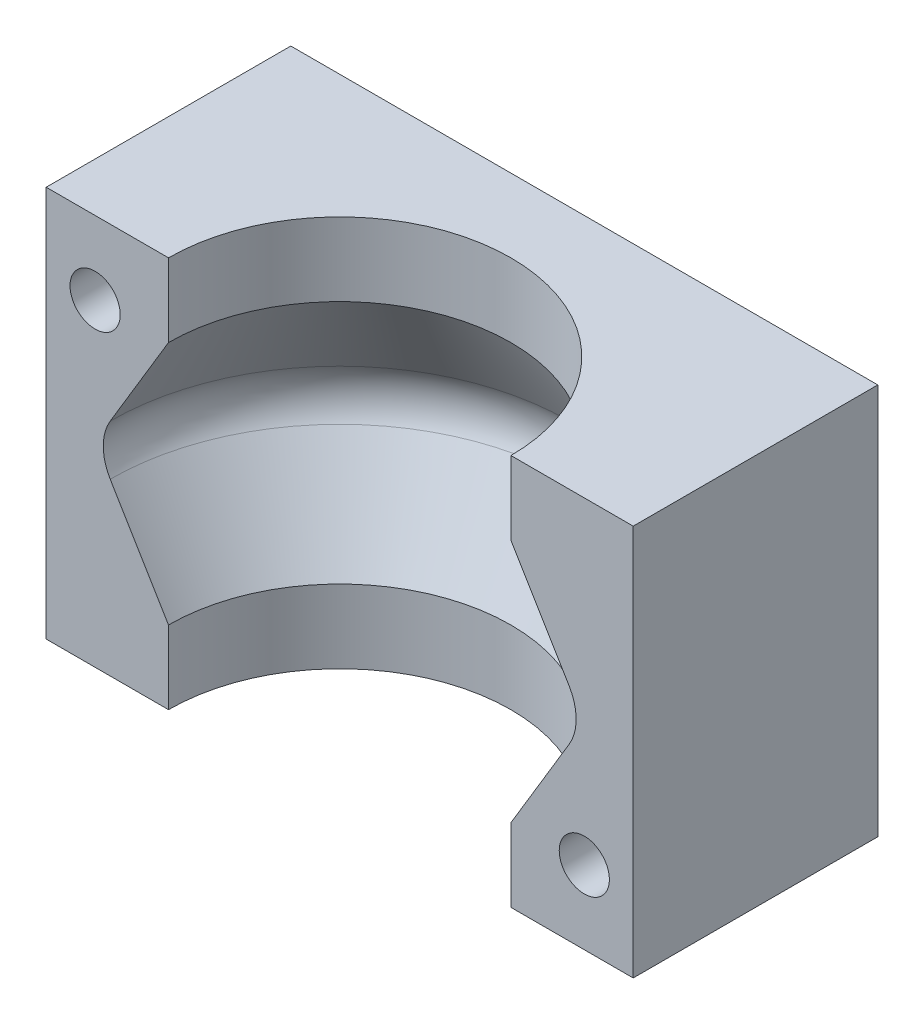
ISO-10303-21;
HEADER;
FILE_DESCRIPTION(('STEP AP214'),'2;1');
FILE_NAME('part.step','',(''),(''),'','','');
FILE_SCHEMA(('AUTOMOTIVE_DESIGN { 1 0 10303 214 1 1 1 1 }'));
ENDSEC;
DATA;
#1=APPLICATION_CONTEXT('core data for automotive mechanical design processes');
#2=APPLICATION_PROTOCOL_DEFINITION('international standard','automotive_design',2000,#1);
#3=PRODUCT_CONTEXT('',#1,'mechanical');
#4=PRODUCT('Part','Part','',(#3));
#5=PRODUCT_RELATED_PRODUCT_CATEGORY('part','',(#4));
#6=PRODUCT_DEFINITION_FORMATION('','',#4);
#7=PRODUCT_DEFINITION_CONTEXT('part definition',#1,'design');
#8=PRODUCT_DEFINITION('design','',#6,#7);
#9=PRODUCT_DEFINITION_SHAPE('','',#8);
#10=(LENGTH_UNIT() NAMED_UNIT(*) SI_UNIT(.MILLI.,.METRE.));
#11=(NAMED_UNIT(*) PLANE_ANGLE_UNIT() SI_UNIT($,.RADIAN.));
#12=(NAMED_UNIT(*) SI_UNIT($,.STERADIAN.) SOLID_ANGLE_UNIT());
#13=UNCERTAINTY_MEASURE_WITH_UNIT(LENGTH_MEASURE(1.E-05),#10,'distance_accuracy_value','');
#14=(GEOMETRIC_REPRESENTATION_CONTEXT(3) GLOBAL_UNCERTAINTY_ASSIGNED_CONTEXT((#13)) GLOBAL_UNIT_ASSIGNED_CONTEXT((#10,
#11,#12)) REPRESENTATION_CONTEXT('',''));
#15=CARTESIAN_POINT('',(0.,0.,0.));
#16=DIRECTION('',(0.,0.,1.));
#17=DIRECTION('',(1.,0.,0.));
#18=AXIS2_PLACEMENT_3D('',#15,#16,#17);
#19=CARTESIAN_POINT('',(0.,0.,50.));
#20=DIRECTION('',(0.,0.,1.));
#21=DIRECTION('',(1.,0.,0.));
#22=AXIS2_PLACEMENT_3D('',#19,#20,#21);
#23=PLANE('',#22);
#24=DIRECTION('',(0.,1.,0.));
#25=VECTOR('',#24,1.);
#26=CARTESIAN_POINT('',(35.,40.,50.));
#27=LINE('',#26,#25);
#28=CARTESIAN_POINT('',(35.,25.,50.));
#29=VERTEX_POINT('',#28);
#30=CARTESIAN_POINT('',(35.,40.,50.));
#31=VERTEX_POINT('',#30);
#32=EDGE_CURVE('E11',#29,#31,#27,.T.);
#33=ORIENTED_EDGE('',*,*,#32,.F.);
#34=DIRECTION('',(-0.514495755427527,0.857492925712544,0.));
#35=VECTOR('',#34,1.);
#36=CARTESIAN_POINT('',(0.,83.3333333333332,50.));
#37=LINE('',#36,#35);
#38=CARTESIAN_POINT('',(46.9130254674348,5.14495755427528,50.));
#39=VERTEX_POINT('',#38);
#40=EDGE_CURVE('E48',#39,#29,#37,.T.);
#41=ORIENTED_EDGE('',*,*,#40,.F.);
#42=CARTESIAN_POINT('',(38.3380962103094,0.,50.));
#43=DIRECTION('',(0.,0.,1.));
#44=DIRECTION('',(1.,0.,0.));
#45=AXIS2_PLACEMENT_3D('',#42,#43,#44);
#46=CIRCLE('',#45,10.);
#47=CARTESIAN_POINT('',(46.9130254674348,-5.14495755427527,50.));
#48=VERTEX_POINT('',#47);
#49=EDGE_CURVE('E203',#48,#39,#46,.T.);
#50=ORIENTED_EDGE('',*,*,#49,.F.);
#51=DIRECTION('',(0.514495755427527,0.857492925712544,0.));
#52=VECTOR('',#51,1.);
#53=CARTESIAN_POINT('',(0.,-83.3333333333332,50.));
#54=LINE('',#53,#52);
#55=CARTESIAN_POINT('',(35.,-25.,50.));
#56=VERTEX_POINT('',#55);
#57=EDGE_CURVE('E141',#56,#48,#54,.T.);
#58=ORIENTED_EDGE('',*,*,#57,.F.);
#59=DIRECTION('',(0.,1.,0.));
#60=VECTOR('',#59,1.);
#61=CARTESIAN_POINT('',(35.,40.,50.));
#62=LINE('',#61,#60);
#63=CARTESIAN_POINT('',(35.,-40.,50.));
#64=VERTEX_POINT('',#63);
#65=EDGE_CURVE('E128',#64,#56,#62,.T.);
#66=ORIENTED_EDGE('',*,*,#65,.F.);
#67=DIRECTION('',(1.,0.,0.));
#68=VECTOR('',#67,1.);
#69=CARTESIAN_POINT('',(60.,-40.,50.));
#70=LINE('',#69,#68);
#71=CARTESIAN_POINT('',(60.,-40.,50.));
#72=VERTEX_POINT('',#71);
#73=EDGE_CURVE('E138',#64,#72,#70,.T.);
#74=ORIENTED_EDGE('',*,*,#73,.T.);
#75=DIRECTION('',(0.,1.,0.));
#76=VECTOR('',#75,1.);
#77=CARTESIAN_POINT('',(60.,-40.,50.));
#78=LINE('',#77,#76);
#79=CARTESIAN_POINT('',(60.,40.,50.));
#80=VERTEX_POINT('',#79);
#81=EDGE_CURVE('E154',#72,#80,#78,.T.);
#82=ORIENTED_EDGE('',*,*,#81,.T.);
#83=DIRECTION('',(-1.,0.,0.));
#84=VECTOR('',#83,1.);
#85=CARTESIAN_POINT('',(60.,40.,50.));
#86=LINE('',#85,#84);
#87=EDGE_CURVE('E160',#80,#31,#86,.T.);
#88=ORIENTED_EDGE('',*,*,#87,.T.);
#89=EDGE_LOOP('',(#33,#41,#50,#58,#66,#74,#82,#88));
#90=FACE_BOUND('',#89,.T.);
#91=CARTESIAN_POINT('',(50.,-25.,50.));
#92=DIRECTION('',(0.,0.,1.));
#93=DIRECTION('',(-1.,0.,0.));
#94=AXIS2_PLACEMENT_3D('',#91,#92,#93);
#95=CIRCLE('',#94,5.125);
#96=CARTESIAN_POINT('',(44.875,-25.,50.));
#97=VERTEX_POINT('',#96);
#98=EDGE_CURVE('E226',#97,#97,#95,.T.);
#99=ORIENTED_EDGE('',*,*,#98,.F.);
#100=EDGE_LOOP('',(#99));
#101=FACE_BOUND('',#100,.T.);
#102=ADVANCED_FACE('F39',(#90,#101),#23,.T.);
#103=CARTESIAN_POINT('',(-60.,-40.,50.));
#104=DIRECTION('',(1.,0.,0.));
#105=DIRECTION('',(0.,0.,-1.));
#106=AXIS2_PLACEMENT_3D('',#103,#104,#105);
#107=PLANE('',#106);
#108=DIRECTION('',(0.,-1.,0.));
#109=VECTOR('',#108,1.);
#110=CARTESIAN_POINT('',(-60.,-40.,0.));
#111=LINE('',#110,#109);
#112=CARTESIAN_POINT('',(-60.,40.,0.));
#113=VERTEX_POINT('',#112);
#114=CARTESIAN_POINT('',(-60.,-40.,0.));
#115=VERTEX_POINT('',#114);
#116=EDGE_CURVE('E165',#113,#115,#111,.T.);
#117=ORIENTED_EDGE('',*,*,#116,.T.);
#118=DIRECTION('',(0.,0.,-1.));
#119=VECTOR('',#118,1.);
#120=CARTESIAN_POINT('',(-60.,-40.,50.));
#121=LINE('',#120,#119);
#122=CARTESIAN_POINT('',(-60.,-40.,50.));
#123=VERTEX_POINT('',#122);
#124=EDGE_CURVE('E185',#123,#115,#121,.T.);
#125=ORIENTED_EDGE('',*,*,#124,.F.);
#126=DIRECTION('',(0.,-1.,0.));
#127=VECTOR('',#126,1.);
#128=CARTESIAN_POINT('',(-60.,-40.,50.));
#129=LINE('',#128,#127);
#130=CARTESIAN_POINT('',(-60.,40.,50.));
#131=VERTEX_POINT('',#130);
#132=EDGE_CURVE('E150',#131,#123,#129,.T.);
#133=ORIENTED_EDGE('',*,*,#132,.F.);
#134=DIRECTION('',(0.,0.,-1.));
#135=VECTOR('',#134,1.);
#136=CARTESIAN_POINT('',(-60.,40.,50.));
#137=LINE('',#136,#135);
#138=EDGE_CURVE('E164',#131,#113,#137,.T.);
#139=ORIENTED_EDGE('',*,*,#138,.T.);
#140=EDGE_LOOP('',(#117,#125,#133,#139));
#141=FACE_BOUND('',#140,.T.);
#142=ADVANCED_FACE('F41',(#141),#107,.F.);
#143=CARTESIAN_POINT('',(60.,-40.,50.));
#144=DIRECTION('',(0.,1.,0.));
#145=DIRECTION('',(-1.,0.,0.));
#146=AXIS2_PLACEMENT_3D('',#143,#144,#145);
#147=PLANE('',#146);
#148=ORIENTED_EDGE('',*,*,#73,.F.);
#149=CARTESIAN_POINT('',(0.,-40.,50.));
#150=DIRECTION('',(0.,1.,0.));
#151=DIRECTION('',(0.,0.,1.));
#152=AXIS2_PLACEMENT_3D('',#149,#150,#151);
#153=CIRCLE('',#152,35.);
#154=CARTESIAN_POINT('',(-35.,-40.,50.));
#155=VERTEX_POINT('',#154);
#156=EDGE_CURVE('E125',#64,#155,#153,.T.);
#157=ORIENTED_EDGE('',*,*,#156,.T.);
#158=EDGE_CURVE('E94',#123,#155,#70,.T.);
#159=ORIENTED_EDGE('',*,*,#158,.F.);
#160=ORIENTED_EDGE('',*,*,#124,.T.);
#161=DIRECTION('',(1.,0.,0.));
#162=VECTOR('',#161,1.);
#163=CARTESIAN_POINT('',(60.,-40.,0.));
#164=LINE('',#163,#162);
#165=CARTESIAN_POINT('',(60.,-40.,0.));
#166=VERTEX_POINT('',#165);
#167=EDGE_CURVE('E169',#115,#166,#164,.T.);
#168=ORIENTED_EDGE('',*,*,#167,.T.);
#169=DIRECTION('',(0.,0.,-1.));
#170=VECTOR('',#169,1.);
#171=CARTESIAN_POINT('',(60.,-40.,50.));
#172=LINE('',#171,#170);
#173=EDGE_CURVE('E147',#72,#166,#172,.T.);
#174=ORIENTED_EDGE('',*,*,#173,.F.);
#175=EDGE_LOOP('',(#148,#157,#159,#160,#168,#174));
#176=FACE_BOUND('',#175,.T.);
#177=ADVANCED_FACE('F145',(#176),#147,.F.);
#178=CARTESIAN_POINT('',(60.,-40.,50.));
#179=DIRECTION('',(-1.,0.,0.));
#180=DIRECTION('',(0.,0.,1.));
#181=AXIS2_PLACEMENT_3D('',#178,#179,#180);
#182=PLANE('',#181);
#183=DIRECTION('',(0.,1.,0.));
#184=VECTOR('',#183,1.);
#185=CARTESIAN_POINT('',(60.,-40.,0.));
#186=LINE('',#185,#184);
#187=CARTESIAN_POINT('',(60.,40.,0.));
#188=VERTEX_POINT('',#187);
#189=EDGE_CURVE('E173',#166,#188,#186,.T.);
#190=ORIENTED_EDGE('',*,*,#189,.T.);
#191=DIRECTION('',(0.,0.,-1.));
#192=VECTOR('',#191,1.);
#193=CARTESIAN_POINT('',(60.,40.,50.));
#194=LINE('',#193,#192);
#195=EDGE_CURVE('E180',#80,#188,#194,.T.);
#196=ORIENTED_EDGE('',*,*,#195,.F.);
#197=ORIENTED_EDGE('',*,*,#81,.F.);
#198=ORIENTED_EDGE('',*,*,#173,.T.);
#199=EDGE_LOOP('',(#190,#196,#197,#198));
#200=FACE_BOUND('',#199,.T.);
#201=ADVANCED_FACE('F266',(#200),#182,.F.);
#202=CARTESIAN_POINT('',(60.,40.,50.));
#203=DIRECTION('',(0.,-1.,0.));
#204=DIRECTION('',(1.,0.,0.));
#205=AXIS2_PLACEMENT_3D('',#202,#203,#204);
#206=PLANE('',#205);
#207=CARTESIAN_POINT('',(-35.,40.,50.));
#208=VERTEX_POINT('',#207);
#209=EDGE_CURVE('E64',#208,#131,#86,.T.);
#210=ORIENTED_EDGE('',*,*,#209,.F.);
#211=CARTESIAN_POINT('',(0.,40.,50.));
#212=DIRECTION('',(0.,1.,0.));
#213=DIRECTION('',(0.,0.,1.));
#214=AXIS2_PLACEMENT_3D('',#211,#212,#213);
#215=CIRCLE('',#214,35.);
#216=EDGE_CURVE('E220',#31,#208,#215,.T.);
#217=ORIENTED_EDGE('',*,*,#216,.F.);
#218=ORIENTED_EDGE('',*,*,#87,.F.);
#219=ORIENTED_EDGE('',*,*,#195,.T.);
#220=DIRECTION('',(-1.,0.,0.));
#221=VECTOR('',#220,1.);
#222=CARTESIAN_POINT('',(60.,40.,0.));
#223=LINE('',#222,#221);
#224=EDGE_CURVE('E86',#188,#113,#223,.T.);
#225=ORIENTED_EDGE('',*,*,#224,.T.);
#226=ORIENTED_EDGE('',*,*,#138,.F.);
#227=EDGE_LOOP('',(#210,#217,#218,#219,#225,#226));
#228=FACE_BOUND('',#227,.T.);
#229=ADVANCED_FACE('F224',(#228),#206,.F.);
#230=DIRECTION('',(0.,1.,0.));
#231=VECTOR('',#230,1.);
#232=CARTESIAN_POINT('',(-35.,40.,50.));
#233=LINE('',#232,#231);
#234=CARTESIAN_POINT('',(-35.,25.,50.));
#235=VERTEX_POINT('',#234);
#236=EDGE_CURVE('E143',#208,#235,#233,.F.);
#237=ORIENTED_EDGE('',*,*,#236,.F.);
#238=ORIENTED_EDGE('',*,*,#209,.T.);
#239=ORIENTED_EDGE('',*,*,#132,.T.);
#240=ORIENTED_EDGE('',*,*,#158,.T.);
#241=DIRECTION('',(0.,1.,0.));
#242=VECTOR('',#241,1.);
#243=CARTESIAN_POINT('',(-35.,40.,50.));
#244=LINE('',#243,#242);
#245=CARTESIAN_POINT('',(-35.,-25.,50.));
#246=VERTEX_POINT('',#245);
#247=EDGE_CURVE('E130',#246,#155,#244,.F.);
#248=ORIENTED_EDGE('',*,*,#247,.F.);
#249=DIRECTION('',(0.514495755427527,-0.857492925712544,0.));
#250=VECTOR('',#249,1.);
#251=CARTESIAN_POINT('',(0.,-83.3333333333332,50.));
#252=LINE('',#251,#250);
#253=CARTESIAN_POINT('',(-46.9130254674348,-5.14495755427527,50.));
#254=VERTEX_POINT('',#253);
#255=EDGE_CURVE('E190',#254,#246,#252,.T.);
#256=ORIENTED_EDGE('',*,*,#255,.F.);
#257=CARTESIAN_POINT('',(-38.3380962103094,0.,50.));
#258=DIRECTION('',(0.,0.,1.));
#259=DIRECTION('',(1.,0.,0.));
#260=AXIS2_PLACEMENT_3D('',#257,#258,#259);
#261=CIRCLE('',#260,10.);
#262=CARTESIAN_POINT('',(-46.9130254674348,5.14495755427528,50.));
#263=VERTEX_POINT('',#262);
#264=EDGE_CURVE('E193',#263,#254,#261,.T.);
#265=ORIENTED_EDGE('',*,*,#264,.F.);
#266=DIRECTION('',(-0.514495755427527,-0.857492925712544,0.));
#267=VECTOR('',#266,1.);
#268=CARTESIAN_POINT('',(0.,83.3333333333332,50.));
#269=LINE('',#268,#267);
#270=EDGE_CURVE('E196',#235,#263,#269,.T.);
#271=ORIENTED_EDGE('',*,*,#270,.F.);
#272=EDGE_LOOP('',(#237,#238,#239,#240,#248,#256,#265,#271));
#273=FACE_BOUND('',#272,.T.);
#274=CARTESIAN_POINT('',(-50.,25.,50.));
#275=DIRECTION('',(0.,0.,1.));
#276=DIRECTION('',(-1.,0.,0.));
#277=AXIS2_PLACEMENT_3D('',#274,#275,#276);
#278=CIRCLE('',#277,5.125);
#279=CARTESIAN_POINT('',(-55.125,25.,50.));
#280=VERTEX_POINT('',#279);
#281=EDGE_CURVE('E236',#280,#280,#278,.T.);
#282=ORIENTED_EDGE('',*,*,#281,.F.);
#283=EDGE_LOOP('',(#282));
#284=FACE_BOUND('',#283,.T.);
#285=ADVANCED_FACE('F254',(#273,#284),#23,.T.);
#286=CARTESIAN_POINT('',(0.,0.,0.));
#287=DIRECTION('',(0.,0.,1.));
#288=DIRECTION('',(1.,0.,0.));
#289=AXIS2_PLACEMENT_3D('',#286,#287,#288);
#290=PLANE('',#289);
#291=ORIENTED_EDGE('',*,*,#116,.F.);
#292=ORIENTED_EDGE('',*,*,#224,.F.);
#293=ORIENTED_EDGE('',*,*,#189,.F.);
#294=ORIENTED_EDGE('',*,*,#167,.F.);
#295=EDGE_LOOP('',(#291,#292,#293,#294));
#296=FACE_BOUND('',#295,.T.);
#297=ADVANCED_FACE('F249',(#296),#290,.F.);
#298=CARTESIAN_POINT('',(50.,-25.,39.8));
#299=DIRECTION('',(0.,0.,1.));
#300=DIRECTION('',(1.,0.,0.));
#301=AXIS2_PLACEMENT_3D('',#298,#299,#300);
#302=CYLINDRICAL_SURFACE('',#301,5.125);
#303=CARTESIAN_POINT('',(50.,-25.,39.8));
#304=DIRECTION('',(0.,0.,1.));
#305=DIRECTION('',(-1.,0.,0.));
#306=AXIS2_PLACEMENT_3D('',#303,#304,#305);
#307=CIRCLE('',#306,5.125);
#308=CARTESIAN_POINT('',(44.875,-25.,39.8));
#309=VERTEX_POINT('',#308);
#310=EDGE_CURVE('E230',#309,#309,#307,.T.);
#311=ORIENTED_EDGE('',*,*,#310,.F.);
#312=EDGE_LOOP('',(#311));
#313=FACE_BOUND('',#312,.T.);
#314=ORIENTED_EDGE('',*,*,#98,.T.);
#315=EDGE_LOOP('',(#314));
#316=FACE_BOUND('',#315,.T.);
#317=ADVANCED_FACE('F246',(#313,#316),#302,.F.);
#318=CARTESIAN_POINT('',(50.,-25.,39.8));
#319=DIRECTION('',(0.,0.,-1.));
#320=DIRECTION('',(-1.,0.,0.));
#321=AXIS2_PLACEMENT_3D('',#318,#319,#320);
#322=PLANE('',#321);
#323=ORIENTED_EDGE('',*,*,#310,.T.);
#324=EDGE_LOOP('',(#323));
#325=FACE_BOUND('',#324,.T.);
#326=ADVANCED_FACE('F244',(#325),#322,.F.);
#327=CARTESIAN_POINT('',(-50.,25.,39.8));
#328=DIRECTION('',(0.,0.,1.));
#329=DIRECTION('',(1.,0.,0.));
#330=AXIS2_PLACEMENT_3D('',#327,#328,#329);
#331=CYLINDRICAL_SURFACE('',#330,5.125);
#332=CARTESIAN_POINT('',(-50.,25.,39.8));
#333=DIRECTION('',(0.,0.,1.));
#334=DIRECTION('',(-1.,0.,0.));
#335=AXIS2_PLACEMENT_3D('',#332,#333,#334);
#336=CIRCLE('',#335,5.125);
#337=CARTESIAN_POINT('',(-55.125,25.,39.8));
#338=VERTEX_POINT('',#337);
#339=EDGE_CURVE('E170',#338,#338,#336,.T.);
#340=ORIENTED_EDGE('',*,*,#339,.F.);
#341=EDGE_LOOP('',(#340));
#342=FACE_BOUND('',#341,.T.);
#343=ORIENTED_EDGE('',*,*,#281,.T.);
#344=EDGE_LOOP('',(#343));
#345=FACE_BOUND('',#344,.T.);
#346=ADVANCED_FACE('F271',(#342,#345),#331,.F.);
#347=CARTESIAN_POINT('',(-50.,25.,39.8));
#348=DIRECTION('',(0.,0.,-1.));
#349=DIRECTION('',(-1.,0.,0.));
#350=AXIS2_PLACEMENT_3D('',#347,#348,#349);
#351=PLANE('',#350);
#352=ORIENTED_EDGE('',*,*,#339,.T.);
#353=EDGE_LOOP('',(#352));
#354=FACE_BOUND('',#353,.T.);
#355=ADVANCED_FACE('F273',(#354),#351,.F.);
#356=CARTESIAN_POINT('',(0.,40.,50.));
#357=DIRECTION('',(0.,1.,0.));
#358=DIRECTION('',(0.,0.,1.));
#359=AXIS2_PLACEMENT_3D('',#356,#357,#358);
#360=CYLINDRICAL_SURFACE('',#359,35.);
#361=ORIENTED_EDGE('',*,*,#32,.T.);
#362=ORIENTED_EDGE('',*,*,#216,.T.);
#363=ORIENTED_EDGE('',*,*,#236,.T.);
#364=CARTESIAN_POINT('',(0.,25.,50.));
#365=DIRECTION('',(0.,1.,0.));
#366=DIRECTION('',(0.,0.,1.));
#367=AXIS2_PLACEMENT_3D('',#364,#365,#366);
#368=CIRCLE('',#367,35.);
#369=EDGE_CURVE('E212',#29,#235,#368,.T.);
#370=ORIENTED_EDGE('',*,*,#369,.F.);
#371=EDGE_LOOP('',(#361,#362,#363,#370));
#372=FACE_BOUND('',#371,.T.);
#373=ADVANCED_FACE('F217',(#372),#360,.F.);
#374=CARTESIAN_POINT('',(0.,25.,50.));
#375=DIRECTION('',(0.,-1.,0.));
#376=DIRECTION('',(0.,0.,-1.));
#377=AXIS2_PLACEMENT_3D('',#374,#375,#376);
#378=CONICAL_SURFACE('',#377,35.,0.540419500270585);
#379=ORIENTED_EDGE('',*,*,#270,.T.);
#380=CARTESIAN_POINT('',(0.,5.14495755427528,50.));
#381=DIRECTION('',(0.,1.,0.));
#382=DIRECTION('',(0.,0.,1.));
#383=AXIS2_PLACEMENT_3D('',#380,#381,#382);
#384=CIRCLE('',#383,46.9130254674348);
#385=EDGE_CURVE('E215',#39,#263,#384,.T.);
#386=ORIENTED_EDGE('',*,*,#385,.F.);
#387=ORIENTED_EDGE('',*,*,#40,.T.);
#388=ORIENTED_EDGE('',*,*,#369,.T.);
#389=EDGE_LOOP('',(#379,#386,#387,#388));
#390=FACE_BOUND('',#389,.T.);
#391=ADVANCED_FACE('F211',(#390),#378,.F.);
#392=CARTESIAN_POINT('',(0.,0.,50.));
#393=DIRECTION('',(0.,1.,0.));
#394=DIRECTION('',(0.,0.,1.));
#395=AXIS2_PLACEMENT_3D('',#392,#393,#394);
#396=TOROIDAL_SURFACE('',#395,38.3380962103094,10.);
#397=ORIENTED_EDGE('',*,*,#49,.T.);
#398=ORIENTED_EDGE('',*,*,#385,.T.);
#399=ORIENTED_EDGE('',*,*,#264,.T.);
#400=CARTESIAN_POINT('',(0.,-5.14495755427527,50.));
#401=DIRECTION('',(0.,1.,0.));
#402=DIRECTION('',(0.,0.,1.));
#403=AXIS2_PLACEMENT_3D('',#400,#401,#402);
#404=CIRCLE('',#403,46.9130254674348);
#405=EDGE_CURVE('E390',#48,#254,#404,.T.);
#406=ORIENTED_EDGE('',*,*,#405,.F.);
#407=EDGE_LOOP('',(#397,#398,#399,#406));
#408=FACE_BOUND('',#407,.T.);
#409=ADVANCED_FACE('F289',(#408),#396,.F.);
#410=CARTESIAN_POINT('',(0.,-5.14495755427527,50.));
#411=DIRECTION('',(0.,1.,0.));
#412=DIRECTION('',(0.,0.,1.));
#413=AXIS2_PLACEMENT_3D('',#410,#411,#412);
#414=CONICAL_SURFACE('',#413,46.9130254674348,0.540419500270585);
#415=ORIENTED_EDGE('',*,*,#57,.T.);
#416=ORIENTED_EDGE('',*,*,#405,.T.);
#417=ORIENTED_EDGE('',*,*,#255,.T.);
#418=CARTESIAN_POINT('',(0.,-25.,50.));
#419=DIRECTION('',(0.,1.,0.));
#420=DIRECTION('',(0.,0.,1.));
#421=AXIS2_PLACEMENT_3D('',#418,#419,#420);
#422=CIRCLE('',#421,35.);
#423=EDGE_CURVE('E55',#56,#246,#422,.T.);
#424=ORIENTED_EDGE('',*,*,#423,.F.);
#425=EDGE_LOOP('',(#415,#416,#417,#424));
#426=FACE_BOUND('',#425,.T.);
#427=ADVANCED_FACE('F292',(#426),#414,.F.);
#428=CARTESIAN_POINT('',(0.,40.,50.));
#429=DIRECTION('',(0.,1.,0.));
#430=DIRECTION('',(0.,0.,1.));
#431=AXIS2_PLACEMENT_3D('',#428,#429,#430);
#432=CYLINDRICAL_SURFACE('',#431,35.);
#433=ORIENTED_EDGE('',*,*,#65,.T.);
#434=ORIENTED_EDGE('',*,*,#423,.T.);
#435=ORIENTED_EDGE('',*,*,#247,.T.);
#436=ORIENTED_EDGE('',*,*,#156,.F.);
#437=EDGE_LOOP('',(#433,#434,#435,#436));
#438=FACE_BOUND('',#437,.T.);
#439=ADVANCED_FACE('F127',(#438),#432,.F.);
#440=CLOSED_SHELL('',(#102,#142,#177,#201,#229,#285,#297,#317,#326,#346,#355,#373,#391,#409,
#427,#439));
#441=MANIFOLD_SOLID_BREP('B2',#440);
#442=ADVANCED_BREP_SHAPE_REPRESENTATION('',(#18,#441),#14);
#443=SHAPE_DEFINITION_REPRESENTATION(#9,#442);
ENDSEC;
END-ISO-10303-21;
